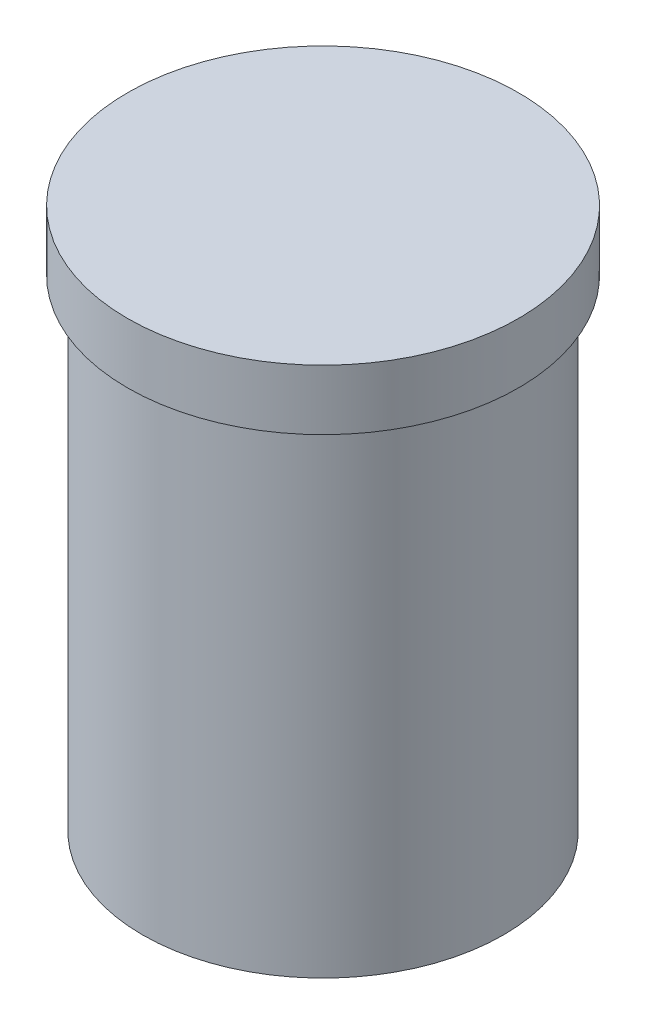
ISO-10303-21;
HEADER;
FILE_DESCRIPTION(('STEP AP214'),'2;1');
FILE_NAME('part.step','',(''),(''),'','','');
FILE_SCHEMA(('AUTOMOTIVE_DESIGN { 1 0 10303 214 1 1 1 1 }'));
ENDSEC;
DATA;
#1=APPLICATION_CONTEXT('core data for automotive mechanical design processes');
#2=APPLICATION_PROTOCOL_DEFINITION('international standard','automotive_design',2000,#1);
#3=PRODUCT_CONTEXT('',#1,'mechanical');
#4=PRODUCT('Part','Part','',(#3));
#5=PRODUCT_RELATED_PRODUCT_CATEGORY('part','',(#4));
#6=PRODUCT_DEFINITION_FORMATION('','',#4);
#7=PRODUCT_DEFINITION_CONTEXT('part definition',#1,'design');
#8=PRODUCT_DEFINITION('design','',#6,#7);
#9=PRODUCT_DEFINITION_SHAPE('','',#8);
#10=(LENGTH_UNIT() NAMED_UNIT(*) SI_UNIT(.MILLI.,.METRE.));
#11=(NAMED_UNIT(*) PLANE_ANGLE_UNIT() SI_UNIT($,.RADIAN.));
#12=(NAMED_UNIT(*) SI_UNIT($,.STERADIAN.) SOLID_ANGLE_UNIT());
#13=UNCERTAINTY_MEASURE_WITH_UNIT(LENGTH_MEASURE(1.E-05),#10,'distance_accuracy_value','');
#14=(GEOMETRIC_REPRESENTATION_CONTEXT(3) GLOBAL_UNCERTAINTY_ASSIGNED_CONTEXT((#13)) GLOBAL_UNIT_ASSIGNED_CONTEXT((#10,
#11,#12)) REPRESENTATION_CONTEXT('',''));
#15=CARTESIAN_POINT('',(0.,0.,0.));
#16=DIRECTION('',(0.,0.,1.));
#17=DIRECTION('',(1.,0.,0.));
#18=AXIS2_PLACEMENT_3D('',#15,#16,#17);
#19=CARTESIAN_POINT('',(0.,101.6,0.));
#20=DIRECTION('',(0.,-1.,0.));
#21=DIRECTION('',(0.,0.,-1.));
#22=AXIS2_PLACEMENT_3D('',#19,#20,#21);
#23=CYLINDRICAL_SURFACE('',#22,38.1);
#24=CARTESIAN_POINT('',(0.,101.6,0.));
#25=DIRECTION('',(0.,1.,0.));
#26=DIRECTION('',(0.,0.,1.));
#27=AXIS2_PLACEMENT_3D('',#24,#25,#26);
#28=CIRCLE('',#27,38.1);
#29=CARTESIAN_POINT('',(0.,101.6,38.1));
#30=VERTEX_POINT('',#29);
#31=EDGE_CURVE('E10',#30,#30,#28,.T.);
#32=ORIENTED_EDGE('',*,*,#31,.F.);
#33=EDGE_LOOP('',(#32));
#34=FACE_BOUND('',#33,.T.);
#35=CARTESIAN_POINT('',(0.,0.,0.));
#36=DIRECTION('',(0.,1.,0.));
#37=DIRECTION('',(0.,0.,1.));
#38=AXIS2_PLACEMENT_3D('',#35,#36,#37);
#39=CIRCLE('',#38,38.1);
#40=CARTESIAN_POINT('',(0.,0.,38.1));
#41=VERTEX_POINT('',#40);
#42=EDGE_CURVE('E38',#41,#41,#39,.T.);
#43=ORIENTED_EDGE('',*,*,#42,.T.);
#44=EDGE_LOOP('',(#43));
#45=FACE_BOUND('',#44,.T.);
#46=ADVANCED_FACE('F35',(#34,#45),#23,.T.);
#47=CARTESIAN_POINT('',(0.,0.,0.));
#48=DIRECTION('',(0.,1.,0.));
#49=DIRECTION('',(0.,0.,1.));
#50=AXIS2_PLACEMENT_3D('',#47,#48,#49);
#51=PLANE('',#50);
#52=ORIENTED_EDGE('',*,*,#42,.F.);
#53=EDGE_LOOP('',(#52));
#54=FACE_BOUND('',#53,.T.);
#55=ADVANCED_FACE('F63',(#54),#51,.F.);
#56=CARTESIAN_POINT('',(0.,101.6,0.));
#57=DIRECTION('',(0.,1.,0.));
#58=DIRECTION('',(0.,0.,1.));
#59=AXIS2_PLACEMENT_3D('',#56,#57,#58);
#60=PLANE('',#59);
#61=CARTESIAN_POINT('',(0.,101.6,0.));
#62=DIRECTION('',(0.,1.,0.));
#63=DIRECTION('',(0.,0.,1.));
#64=AXIS2_PLACEMENT_3D('',#61,#62,#63);
#65=CIRCLE('',#64,41.275);
#66=CARTESIAN_POINT('',(0.,101.6,41.275));
#67=VERTEX_POINT('',#66);
#68=EDGE_CURVE('E47',#67,#67,#65,.T.);
#69=ORIENTED_EDGE('',*,*,#68,.F.);
#70=EDGE_LOOP('',(#69));
#71=FACE_BOUND('',#70,.T.);
#72=ORIENTED_EDGE('',*,*,#31,.T.);
#73=EDGE_LOOP('',(#72));
#74=FACE_BOUND('',#73,.T.);
#75=ADVANCED_FACE('F58',(#71,#74),#60,.F.);
#76=CARTESIAN_POINT('',(0.,114.3,0.));
#77=DIRECTION('',(0.,-1.,0.));
#78=DIRECTION('',(0.,0.,-1.));
#79=AXIS2_PLACEMENT_3D('',#76,#77,#78);
#80=CYLINDRICAL_SURFACE('',#79,41.275);
#81=CARTESIAN_POINT('',(0.,114.3,0.));
#82=DIRECTION('',(0.,1.,0.));
#83=DIRECTION('',(0.,0.,1.));
#84=AXIS2_PLACEMENT_3D('',#81,#82,#83);
#85=CIRCLE('',#84,41.275);
#86=CARTESIAN_POINT('',(0.,114.3,41.275));
#87=VERTEX_POINT('',#86);
#88=EDGE_CURVE('E45',#87,#87,#85,.T.);
#89=ORIENTED_EDGE('',*,*,#88,.F.);
#90=EDGE_LOOP('',(#89));
#91=FACE_BOUND('',#90,.T.);
#92=ORIENTED_EDGE('',*,*,#68,.T.);
#93=EDGE_LOOP('',(#92));
#94=FACE_BOUND('',#93,.T.);
#95=ADVANCED_FACE('F55',(#91,#94),#80,.T.);
#96=CARTESIAN_POINT('',(0.,114.3,0.));
#97=DIRECTION('',(0.,1.,0.));
#98=DIRECTION('',(0.,0.,1.));
#99=AXIS2_PLACEMENT_3D('',#96,#97,#98);
#100=PLANE('',#99);
#101=ORIENTED_EDGE('',*,*,#88,.T.);
#102=EDGE_LOOP('',(#101));
#103=FACE_BOUND('',#102,.T.);
#104=ADVANCED_FACE('F53',(#103),#100,.T.);
#105=CLOSED_SHELL('',(#46,#55,#75,#95,#104));
#106=MANIFOLD_SOLID_BREP('B2',#105);
#107=ADVANCED_BREP_SHAPE_REPRESENTATION('',(#18,#106),#14);
#108=SHAPE_DEFINITION_REPRESENTATION(#9,#107);
ENDSEC;
END-ISO-10303-21;
